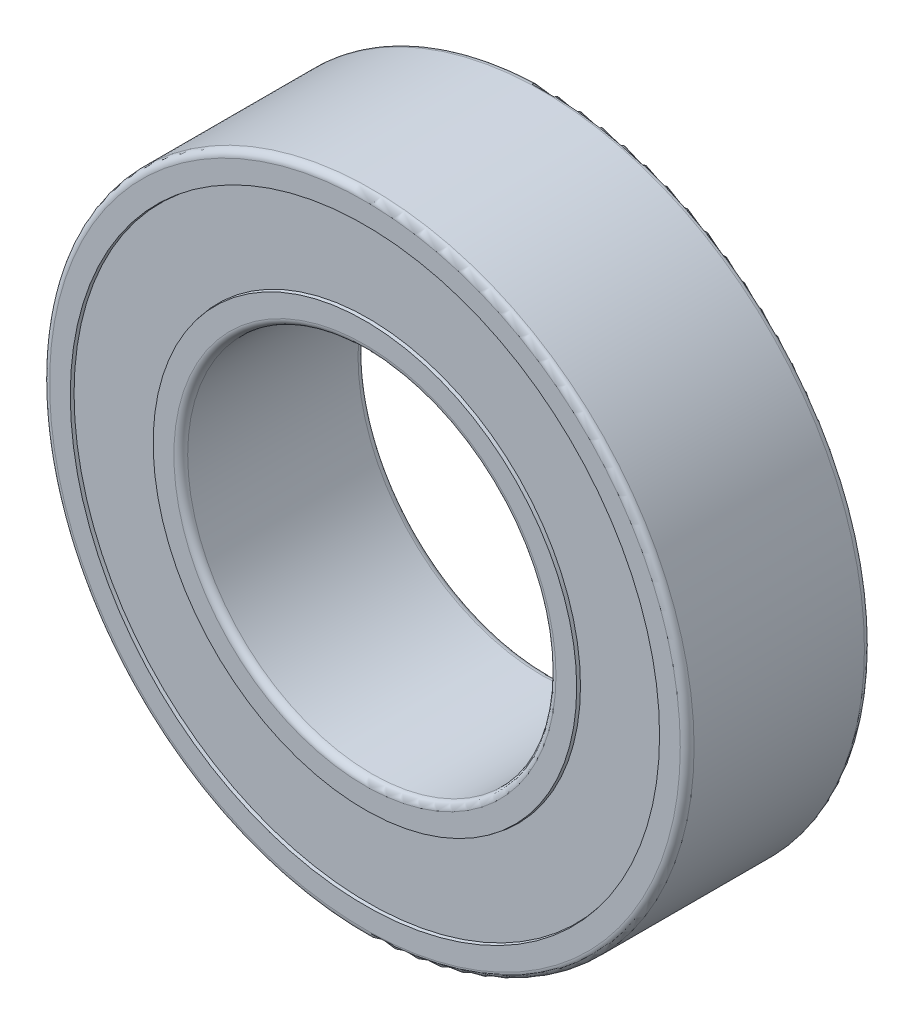
ISO-10303-21;
HEADER;
FILE_DESCRIPTION(('STEP AP214'),'2;1');
FILE_NAME('part.step','',(''),(''),'','','');
FILE_SCHEMA(('AUTOMOTIVE_DESIGN { 1 0 10303 214 1 1 1 1 }'));
ENDSEC;
DATA;
#1=APPLICATION_CONTEXT('core data for automotive mechanical design processes');
#2=APPLICATION_PROTOCOL_DEFINITION('international standard','automotive_design',2000,#1);
#3=PRODUCT_CONTEXT('',#1,'mechanical');
#4=PRODUCT('Part','Part','',(#3));
#5=PRODUCT_RELATED_PRODUCT_CATEGORY('part','',(#4));
#6=PRODUCT_DEFINITION_FORMATION('','',#4);
#7=PRODUCT_DEFINITION_CONTEXT('part definition',#1,'design');
#8=PRODUCT_DEFINITION('design','',#6,#7);
#9=PRODUCT_DEFINITION_SHAPE('','',#8);
#10=(LENGTH_UNIT() NAMED_UNIT(*) SI_UNIT(.MILLI.,.METRE.));
#11=(NAMED_UNIT(*) PLANE_ANGLE_UNIT() SI_UNIT($,.RADIAN.));
#12=(NAMED_UNIT(*) SI_UNIT($,.STERADIAN.) SOLID_ANGLE_UNIT());
#13=UNCERTAINTY_MEASURE_WITH_UNIT(LENGTH_MEASURE(1.E-05),#10,'distance_accuracy_value','');
#14=(GEOMETRIC_REPRESENTATION_CONTEXT(3) GLOBAL_UNCERTAINTY_ASSIGNED_CONTEXT((#13)) GLOBAL_UNIT_ASSIGNED_CONTEXT((#10,
#11,#12)) REPRESENTATION_CONTEXT('',''));
#15=CARTESIAN_POINT('',(0.,0.,0.));
#16=DIRECTION('',(0.,0.,1.));
#17=DIRECTION('',(1.,0.,0.));
#18=AXIS2_PLACEMENT_3D('',#15,#16,#17);
#19=CARTESIAN_POINT('',(0.,0.,1.93));
#20=DIRECTION('',(0.,0.,-1.));
#21=DIRECTION('',(-1.,0.,0.));
#22=AXIS2_PLACEMENT_3D('',#19,#20,#21);
#23=CONICAL_SURFACE('',#22,4.61234288864959,0.17453292519942);
#24=CARTESIAN_POINT('',(0.,0.,2.));
#25=DIRECTION('',(0.,0.,1.));
#26=DIRECTION('',(1.,0.,0.));
#27=AXIS2_PLACEMENT_3D('',#24,#25,#26);
#28=CIRCLE('',#27,4.6);
#29=CARTESIAN_POINT('',(4.6,0.,2.));
#30=VERTEX_POINT('',#29);
#31=EDGE_CURVE('E10',#30,#30,#28,.T.);
#32=ORIENTED_EDGE('',*,*,#31,.F.);
#33=EDGE_LOOP('',(#32));
#34=FACE_BOUND('',#33,.T.);
#35=CARTESIAN_POINT('',(0.,0.,1.93));
#36=DIRECTION('',(0.,0.,1.));
#37=DIRECTION('',(1.,0.,0.));
#38=AXIS2_PLACEMENT_3D('',#35,#36,#37);
#39=CIRCLE('',#38,4.61234288864959);
#40=CARTESIAN_POINT('',(4.61234288864959,0.,1.93));
#41=VERTEX_POINT('',#40);
#42=EDGE_CURVE('E97',#41,#41,#39,.T.);
#43=ORIENTED_EDGE('',*,*,#42,.T.);
#44=EDGE_LOOP('',(#43));
#45=FACE_BOUND('',#44,.T.);
#46=ADVANCED_FACE('F37',(#34,#45),#23,.T.);
#47=CARTESIAN_POINT('',(0.,4.6,2.));
#48=DIRECTION('',(0.,0.,-1.));
#49=DIRECTION('',(-1.,0.,0.));
#50=AXIS2_PLACEMENT_3D('',#47,#48,#49);
#51=PLANE('',#50);
#52=CARTESIAN_POINT('',(0.,0.,2.));
#53=DIRECTION('',(0.,0.,1.));
#54=DIRECTION('',(1.,0.,0.));
#55=AXIS2_PLACEMENT_3D('',#52,#53,#54);
#56=CIRCLE('',#55,4.15);
#57=CARTESIAN_POINT('',(4.15,0.,2.));
#58=VERTEX_POINT('',#57);
#59=EDGE_CURVE('E43',#58,#58,#56,.T.);
#60=ORIENTED_EDGE('',*,*,#59,.F.);
#61=EDGE_LOOP('',(#60));
#62=FACE_BOUND('',#61,.T.);
#63=ORIENTED_EDGE('',*,*,#31,.T.);
#64=EDGE_LOOP('',(#63));
#65=FACE_BOUND('',#64,.T.);
#66=ADVANCED_FACE('F182',(#62,#65),#51,.F.);
#67=CARTESIAN_POINT('',(0.,0.,1.85));
#68=DIRECTION('',(0.,0.,1.));
#69=DIRECTION('',(1.,0.,0.));
#70=AXIS2_PLACEMENT_3D('',#67,#68,#69);
#71=TOROIDAL_SURFACE('',#70,4.15,0.15);
#72=CARTESIAN_POINT('',(0.,0.,1.85));
#73=DIRECTION('',(0.,0.,1.));
#74=DIRECTION('',(1.,0.,0.));
#75=AXIS2_PLACEMENT_3D('',#72,#73,#74);
#76=CIRCLE('',#75,4.);
#77=CARTESIAN_POINT('',(4.,0.,1.85));
#78=VERTEX_POINT('',#77);
#79=EDGE_CURVE('E47',#78,#78,#76,.T.);
#80=ORIENTED_EDGE('',*,*,#79,.F.);
#81=EDGE_LOOP('',(#80));
#82=FACE_BOUND('',#81,.T.);
#83=ORIENTED_EDGE('',*,*,#59,.T.);
#84=EDGE_LOOP('',(#83));
#85=FACE_BOUND('',#84,.T.);
#86=ADVANCED_FACE('F177',(#82,#85),#71,.T.);
#87=CARTESIAN_POINT('',(0.,0.,0.));
#88=DIRECTION('',(0.,0.,1.));
#89=DIRECTION('',(1.,0.,0.));
#90=AXIS2_PLACEMENT_3D('',#87,#88,#89);
#91=CYLINDRICAL_SURFACE('',#90,4.);
#92=CARTESIAN_POINT('',(0.,0.,-1.85));
#93=DIRECTION('',(0.,0.,1.));
#94=DIRECTION('',(1.,0.,0.));
#95=AXIS2_PLACEMENT_3D('',#92,#93,#94);
#96=CIRCLE('',#95,4.);
#97=CARTESIAN_POINT('',(4.,0.,-1.85));
#98=VERTEX_POINT('',#97);
#99=EDGE_CURVE('E51',#98,#98,#96,.T.);
#100=ORIENTED_EDGE('',*,*,#99,.F.);
#101=EDGE_LOOP('',(#100));
#102=FACE_BOUND('',#101,.T.);
#103=ORIENTED_EDGE('',*,*,#79,.T.);
#104=EDGE_LOOP('',(#103));
#105=FACE_BOUND('',#104,.T.);
#106=ADVANCED_FACE('F171',(#102,#105),#91,.F.);
#107=CARTESIAN_POINT('',(0.,0.,-1.85));
#108=DIRECTION('',(0.,0.,1.));
#109=DIRECTION('',(1.,0.,0.));
#110=AXIS2_PLACEMENT_3D('',#107,#108,#109);
#111=TOROIDAL_SURFACE('',#110,4.15,0.15);
#112=CARTESIAN_POINT('',(0.,0.,-2.));
#113=DIRECTION('',(0.,0.,1.));
#114=DIRECTION('',(1.,0.,0.));
#115=AXIS2_PLACEMENT_3D('',#112,#113,#114);
#116=CIRCLE('',#115,4.15);
#117=CARTESIAN_POINT('',(4.15,0.,-2.));
#118=VERTEX_POINT('',#117);
#119=EDGE_CURVE('E57',#118,#118,#116,.T.);
#120=ORIENTED_EDGE('',*,*,#119,.F.);
#121=EDGE_LOOP('',(#120));
#122=FACE_BOUND('',#121,.T.);
#123=ORIENTED_EDGE('',*,*,#99,.T.);
#124=EDGE_LOOP('',(#123));
#125=FACE_BOUND('',#124,.T.);
#126=ADVANCED_FACE('F165',(#122,#125),#111,.T.);
#127=CARTESIAN_POINT('',(0.,4.6,-2.));
#128=DIRECTION('',(0.,0.,1.));
#129=DIRECTION('',(1.,0.,0.));
#130=AXIS2_PLACEMENT_3D('',#127,#128,#129);
#131=PLANE('',#130);
#132=CARTESIAN_POINT('',(0.,0.,-2.));
#133=DIRECTION('',(0.,0.,1.));
#134=DIRECTION('',(1.,0.,0.));
#135=AXIS2_PLACEMENT_3D('',#132,#133,#134);
#136=CIRCLE('',#135,4.6);
#137=CARTESIAN_POINT('',(4.6,0.,-2.));
#138=VERTEX_POINT('',#137);
#139=EDGE_CURVE('E61',#138,#138,#136,.T.);
#140=ORIENTED_EDGE('',*,*,#139,.F.);
#141=EDGE_LOOP('',(#140));
#142=FACE_BOUND('',#141,.T.);
#143=ORIENTED_EDGE('',*,*,#119,.T.);
#144=EDGE_LOOP('',(#143));
#145=FACE_BOUND('',#144,.T.);
#146=ADVANCED_FACE('F159',(#142,#145),#131,.F.);
#147=CARTESIAN_POINT('',(0.,0.,-2.));
#148=DIRECTION('',(0.,0.,1.));
#149=DIRECTION('',(1.,0.,0.));
#150=AXIS2_PLACEMENT_3D('',#147,#148,#149);
#151=CONICAL_SURFACE('',#150,4.6,0.17453292519942);
#152=CARTESIAN_POINT('',(0.,0.,-1.93));
#153=DIRECTION('',(0.,0.,1.));
#154=DIRECTION('',(1.,0.,0.));
#155=AXIS2_PLACEMENT_3D('',#152,#153,#154);
#156=CIRCLE('',#155,4.61234288864959);
#157=CARTESIAN_POINT('',(4.61234288864959,0.,-1.93));
#158=VERTEX_POINT('',#157);
#159=EDGE_CURVE('E65',#158,#158,#156,.T.);
#160=ORIENTED_EDGE('',*,*,#159,.F.);
#161=EDGE_LOOP('',(#160));
#162=FACE_BOUND('',#161,.T.);
#163=ORIENTED_EDGE('',*,*,#139,.T.);
#164=EDGE_LOOP('',(#163));
#165=FACE_BOUND('',#164,.T.);
#166=ADVANCED_FACE('F153',(#162,#165),#151,.T.);
#167=CARTESIAN_POINT('',(0.,6.38765711135041,-1.93));
#168=DIRECTION('',(0.,0.,1.));
#169=DIRECTION('',(1.,0.,0.));
#170=AXIS2_PLACEMENT_3D('',#167,#168,#169);
#171=PLANE('',#170);
#172=CARTESIAN_POINT('',(0.,0.,-1.93));
#173=DIRECTION('',(0.,0.,1.));
#174=DIRECTION('',(1.,0.,0.));
#175=AXIS2_PLACEMENT_3D('',#172,#173,#174);
#176=CIRCLE('',#175,6.38765711135041);
#177=CARTESIAN_POINT('',(6.38765711135041,0.,-1.93));
#178=VERTEX_POINT('',#177);
#179=EDGE_CURVE('E69',#178,#178,#176,.T.);
#180=ORIENTED_EDGE('',*,*,#179,.F.);
#181=EDGE_LOOP('',(#180));
#182=FACE_BOUND('',#181,.T.);
#183=ORIENTED_EDGE('',*,*,#159,.T.);
#184=EDGE_LOOP('',(#183));
#185=FACE_BOUND('',#184,.T.);
#186=ADVANCED_FACE('F147',(#182,#185),#171,.F.);
#187=CARTESIAN_POINT('',(0.,0.,-1.93));
#188=DIRECTION('',(0.,0.,-1.));
#189=DIRECTION('',(-1.,0.,0.));
#190=AXIS2_PLACEMENT_3D('',#187,#188,#189);
#191=CONICAL_SURFACE('',#190,6.38765711135041,0.17453292519942);
#192=CARTESIAN_POINT('',(0.,0.,-2.));
#193=DIRECTION('',(0.,0.,1.));
#194=DIRECTION('',(1.,0.,0.));
#195=AXIS2_PLACEMENT_3D('',#192,#193,#194);
#196=CIRCLE('',#195,6.4);
#197=CARTESIAN_POINT('',(6.4,0.,-2.));
#198=VERTEX_POINT('',#197);
#199=EDGE_CURVE('E72',#198,#198,#196,.T.);
#200=ORIENTED_EDGE('',*,*,#199,.F.);
#201=EDGE_LOOP('',(#200));
#202=FACE_BOUND('',#201,.T.);
#203=ORIENTED_EDGE('',*,*,#179,.T.);
#204=EDGE_LOOP('',(#203));
#205=FACE_BOUND('',#204,.T.);
#206=ADVANCED_FACE('F141',(#202,#205),#191,.F.);
#207=CARTESIAN_POINT('',(0.,6.85,-2.));
#208=DIRECTION('',(0.,0.,1.));
#209=DIRECTION('',(1.,0.,0.));
#210=AXIS2_PLACEMENT_3D('',#207,#208,#209);
#211=PLANE('',#210);
#212=CARTESIAN_POINT('',(0.,0.,-2.));
#213=DIRECTION('',(0.,0.,1.));
#214=DIRECTION('',(1.,0.,0.));
#215=AXIS2_PLACEMENT_3D('',#212,#213,#214);
#216=CIRCLE('',#215,6.85);
#217=CARTESIAN_POINT('',(6.85,0.,-2.));
#218=VERTEX_POINT('',#217);
#219=EDGE_CURVE('E75',#218,#218,#216,.T.);
#220=ORIENTED_EDGE('',*,*,#219,.F.);
#221=EDGE_LOOP('',(#220));
#222=FACE_BOUND('',#221,.T.);
#223=ORIENTED_EDGE('',*,*,#199,.T.);
#224=EDGE_LOOP('',(#223));
#225=FACE_BOUND('',#224,.T.);
#226=ADVANCED_FACE('F135',(#222,#225),#211,.F.);
#227=CARTESIAN_POINT('',(0.,0.,-1.85));
#228=DIRECTION('',(0.,0.,1.));
#229=DIRECTION('',(1.,0.,0.));
#230=AXIS2_PLACEMENT_3D('',#227,#228,#229);
#231=TOROIDAL_SURFACE('',#230,6.85,0.15);
#232=CARTESIAN_POINT('',(0.,0.,-1.85));
#233=DIRECTION('',(0.,0.,1.));
#234=DIRECTION('',(1.,0.,0.));
#235=AXIS2_PLACEMENT_3D('',#232,#233,#234);
#236=CIRCLE('',#235,7.);
#237=CARTESIAN_POINT('',(7.,0.,-1.85));
#238=VERTEX_POINT('',#237);
#239=EDGE_CURVE('E78',#238,#238,#236,.T.);
#240=ORIENTED_EDGE('',*,*,#239,.F.);
#241=EDGE_LOOP('',(#240));
#242=FACE_BOUND('',#241,.T.);
#243=ORIENTED_EDGE('',*,*,#219,.T.);
#244=EDGE_LOOP('',(#243));
#245=FACE_BOUND('',#244,.T.);
#246=ADVANCED_FACE('F129',(#242,#245),#231,.T.);
#247=CARTESIAN_POINT('',(0.,0.,0.));
#248=DIRECTION('',(0.,0.,1.));
#249=DIRECTION('',(1.,0.,0.));
#250=AXIS2_PLACEMENT_3D('',#247,#248,#249);
#251=CYLINDRICAL_SURFACE('',#250,7.);
#252=CARTESIAN_POINT('',(0.,0.,1.85));
#253=DIRECTION('',(0.,0.,1.));
#254=DIRECTION('',(1.,0.,0.));
#255=AXIS2_PLACEMENT_3D('',#252,#253,#254);
#256=CIRCLE('',#255,7.);
#257=CARTESIAN_POINT('',(7.,0.,1.85));
#258=VERTEX_POINT('',#257);
#259=EDGE_CURVE('E81',#258,#258,#256,.T.);
#260=ORIENTED_EDGE('',*,*,#259,.F.);
#261=EDGE_LOOP('',(#260));
#262=FACE_BOUND('',#261,.T.);
#263=ORIENTED_EDGE('',*,*,#239,.T.);
#264=EDGE_LOOP('',(#263));
#265=FACE_BOUND('',#264,.T.);
#266=ADVANCED_FACE('F123',(#262,#265),#251,.T.);
#267=CARTESIAN_POINT('',(0.,0.,1.85));
#268=DIRECTION('',(0.,0.,1.));
#269=DIRECTION('',(1.,0.,0.));
#270=AXIS2_PLACEMENT_3D('',#267,#268,#269);
#271=TOROIDAL_SURFACE('',#270,6.85,0.15);
#272=CARTESIAN_POINT('',(0.,0.,2.));
#273=DIRECTION('',(0.,0.,1.));
#274=DIRECTION('',(1.,0.,0.));
#275=AXIS2_PLACEMENT_3D('',#272,#273,#274);
#276=CIRCLE('',#275,6.85);
#277=CARTESIAN_POINT('',(6.85,0.,2.));
#278=VERTEX_POINT('',#277);
#279=EDGE_CURVE('E85',#278,#278,#276,.T.);
#280=ORIENTED_EDGE('',*,*,#279,.F.);
#281=EDGE_LOOP('',(#280));
#282=FACE_BOUND('',#281,.T.);
#283=ORIENTED_EDGE('',*,*,#259,.T.);
#284=EDGE_LOOP('',(#283));
#285=FACE_BOUND('',#284,.T.);
#286=ADVANCED_FACE('F117',(#282,#285),#271,.T.);
#287=CARTESIAN_POINT('',(0.,6.85,2.));
#288=DIRECTION('',(0.,0.,-1.));
#289=DIRECTION('',(-1.,0.,0.));
#290=AXIS2_PLACEMENT_3D('',#287,#288,#289);
#291=PLANE('',#290);
#292=CARTESIAN_POINT('',(0.,0.,2.));
#293=DIRECTION('',(0.,0.,1.));
#294=DIRECTION('',(1.,0.,0.));
#295=AXIS2_PLACEMENT_3D('',#292,#293,#294);
#296=CIRCLE('',#295,6.4);
#297=CARTESIAN_POINT('',(6.4,0.,2.));
#298=VERTEX_POINT('',#297);
#299=EDGE_CURVE('E89',#298,#298,#296,.T.);
#300=ORIENTED_EDGE('',*,*,#299,.F.);
#301=EDGE_LOOP('',(#300));
#302=FACE_BOUND('',#301,.T.);
#303=ORIENTED_EDGE('',*,*,#279,.T.);
#304=EDGE_LOOP('',(#303));
#305=FACE_BOUND('',#304,.T.);
#306=ADVANCED_FACE('F111',(#302,#305),#291,.F.);
#307=CARTESIAN_POINT('',(0.,0.,2.));
#308=DIRECTION('',(0.,0.,1.));
#309=DIRECTION('',(1.,0.,0.));
#310=AXIS2_PLACEMENT_3D('',#307,#308,#309);
#311=CONICAL_SURFACE('',#310,6.4,0.17453292519942);
#312=CARTESIAN_POINT('',(0.,0.,1.93));
#313=DIRECTION('',(0.,0.,1.));
#314=DIRECTION('',(1.,0.,0.));
#315=AXIS2_PLACEMENT_3D('',#312,#313,#314);
#316=CIRCLE('',#315,6.38765711135041);
#317=CARTESIAN_POINT('',(6.38765711135041,0.,1.93));
#318=VERTEX_POINT('',#317);
#319=EDGE_CURVE('E93',#318,#318,#316,.T.);
#320=ORIENTED_EDGE('',*,*,#319,.F.);
#321=EDGE_LOOP('',(#320));
#322=FACE_BOUND('',#321,.T.);
#323=ORIENTED_EDGE('',*,*,#299,.T.);
#324=EDGE_LOOP('',(#323));
#325=FACE_BOUND('',#324,.T.);
#326=ADVANCED_FACE('F105',(#322,#325),#311,.F.);
#327=CARTESIAN_POINT('',(0.,6.38765711135041,1.93));
#328=DIRECTION('',(0.,0.,-1.));
#329=DIRECTION('',(-1.,0.,0.));
#330=AXIS2_PLACEMENT_3D('',#327,#328,#329);
#331=PLANE('',#330);
#332=ORIENTED_EDGE('',*,*,#42,.F.);
#333=EDGE_LOOP('',(#332));
#334=FACE_BOUND('',#333,.T.);
#335=ORIENTED_EDGE('',*,*,#319,.T.);
#336=EDGE_LOOP('',(#335));
#337=FACE_BOUND('',#336,.T.);
#338=ADVANCED_FACE('F102',(#334,#337),#331,.F.);
#339=CLOSED_SHELL('',(#46,#66,#86,#106,#126,#146,#166,#186,#206,#226,#246,#266,#286,#306,#326,#338));
#340=MANIFOLD_SOLID_BREP('B2',#339);
#341=ADVANCED_BREP_SHAPE_REPRESENTATION('',(#18,#340),#14);
#342=SHAPE_DEFINITION_REPRESENTATION(#9,#341);
ENDSEC;
END-ISO-10303-21;
